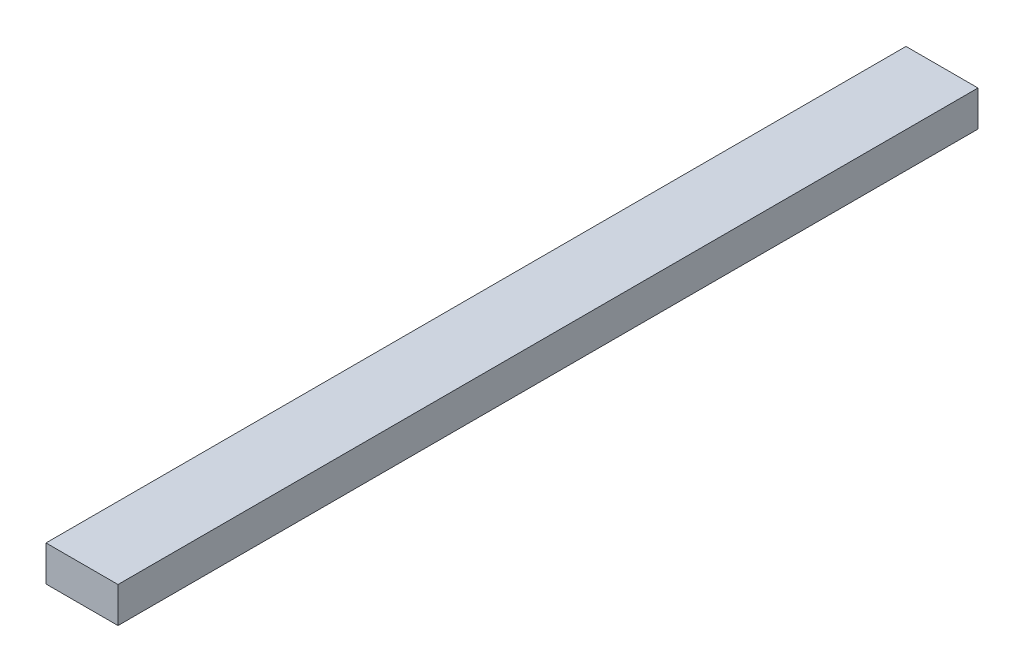
ISO-10303-21;
HEADER;
FILE_DESCRIPTION(('STEP AP214'),'2;1');
FILE_NAME('part.step','',(''),(''),'','','');
FILE_SCHEMA(('AUTOMOTIVE_DESIGN { 1 0 10303 214 1 1 1 1 }'));
ENDSEC;
DATA;
#1=APPLICATION_CONTEXT('core data for automotive mechanical design processes');
#2=APPLICATION_PROTOCOL_DEFINITION('international standard','automotive_design',2000,#1);
#3=PRODUCT_CONTEXT('',#1,'mechanical');
#4=PRODUCT('Part','Part','',(#3));
#5=PRODUCT_RELATED_PRODUCT_CATEGORY('part','',(#4));
#6=PRODUCT_DEFINITION_FORMATION('','',#4);
#7=PRODUCT_DEFINITION_CONTEXT('part definition',#1,'design');
#8=PRODUCT_DEFINITION('design','',#6,#7);
#9=PRODUCT_DEFINITION_SHAPE('','',#8);
#10=(LENGTH_UNIT() NAMED_UNIT(*) SI_UNIT(.MILLI.,.METRE.));
#11=(NAMED_UNIT(*) PLANE_ANGLE_UNIT() SI_UNIT($,.RADIAN.));
#12=(NAMED_UNIT(*) SI_UNIT($,.STERADIAN.) SOLID_ANGLE_UNIT());
#13=UNCERTAINTY_MEASURE_WITH_UNIT(LENGTH_MEASURE(1.E-05),#10,'distance_accuracy_value','');
#14=(GEOMETRIC_REPRESENTATION_CONTEXT(3) GLOBAL_UNCERTAINTY_ASSIGNED_CONTEXT((#13)) GLOBAL_UNIT_ASSIGNED_CONTEXT((#10,
#11,#12)) REPRESENTATION_CONTEXT('',''));
#15=CARTESIAN_POINT('',(0.,0.,0.));
#16=DIRECTION('',(0.,0.,1.));
#17=DIRECTION('',(1.,0.,0.));
#18=AXIS2_PLACEMENT_3D('',#15,#16,#17);
#19=CARTESIAN_POINT('',(6.07,-3.,145.));
#20=DIRECTION('',(-1.,0.,0.));
#21=DIRECTION('',(0.,0.,1.));
#22=AXIS2_PLACEMENT_3D('',#19,#20,#21);
#23=PLANE('',#22);
#24=DIRECTION('',(0.,1.,0.));
#25=VECTOR('',#24,1.);
#26=CARTESIAN_POINT('',(6.07,-3.,0.));
#27=LINE('',#26,#25);
#28=CARTESIAN_POINT('',(6.07,-3.,0.));
#29=VERTEX_POINT('',#28);
#30=CARTESIAN_POINT('',(6.07,3.,0.));
#31=VERTEX_POINT('',#30);
#32=EDGE_CURVE('E95',#29,#31,#27,.T.);
#33=ORIENTED_EDGE('',*,*,#32,.T.);
#34=DIRECTION('',(0.,0.,-1.));
#35=VECTOR('',#34,1.);
#36=CARTESIAN_POINT('',(6.07,3.,145.));
#37=LINE('',#36,#35);
#38=CARTESIAN_POINT('',(6.07,3.,145.));
#39=VERTEX_POINT('',#38);
#40=EDGE_CURVE('E11',#39,#31,#37,.T.);
#41=ORIENTED_EDGE('',*,*,#40,.F.);
#42=DIRECTION('',(0.,1.,0.));
#43=VECTOR('',#42,1.);
#44=CARTESIAN_POINT('',(6.07,-3.,145.));
#45=LINE('',#44,#43);
#46=CARTESIAN_POINT('',(6.07,-3.,145.));
#47=VERTEX_POINT('',#46);
#48=EDGE_CURVE('E83',#47,#39,#45,.T.);
#49=ORIENTED_EDGE('',*,*,#48,.F.);
#50=DIRECTION('',(0.,0.,-1.));
#51=VECTOR('',#50,1.);
#52=CARTESIAN_POINT('',(6.07,-3.,145.));
#53=LINE('',#52,#51);
#54=EDGE_CURVE('E91',#47,#29,#53,.T.);
#55=ORIENTED_EDGE('',*,*,#54,.T.);
#56=EDGE_LOOP('',(#33,#41,#49,#55));
#57=FACE_BOUND('',#56,.T.);
#58=ADVANCED_FACE('F32',(#57),#23,.F.);
#59=CARTESIAN_POINT('',(-6.07,3.,145.));
#60=DIRECTION('',(0.,-1.,0.));
#61=DIRECTION('',(0.,0.,-1.));
#62=AXIS2_PLACEMENT_3D('',#59,#60,#61);
#63=PLANE('',#62);
#64=DIRECTION('',(-1.,0.,0.));
#65=VECTOR('',#64,1.);
#66=CARTESIAN_POINT('',(-6.07,3.,0.));
#67=LINE('',#66,#65);
#68=CARTESIAN_POINT('',(-6.07,3.,0.));
#69=VERTEX_POINT('',#68);
#70=EDGE_CURVE('E87',#31,#69,#67,.T.);
#71=ORIENTED_EDGE('',*,*,#70,.T.);
#72=DIRECTION('',(0.,0.,-1.));
#73=VECTOR('',#72,1.);
#74=CARTESIAN_POINT('',(-6.07,3.,145.));
#75=LINE('',#74,#73);
#76=CARTESIAN_POINT('',(-6.07,3.,145.));
#77=VERTEX_POINT('',#76);
#78=EDGE_CURVE('E40',#77,#69,#75,.T.);
#79=ORIENTED_EDGE('',*,*,#78,.F.);
#80=DIRECTION('',(-1.,0.,0.));
#81=VECTOR('',#80,1.);
#82=CARTESIAN_POINT('',(-6.07,3.,145.));
#83=LINE('',#82,#81);
#84=EDGE_CURVE('E78',#39,#77,#83,.T.);
#85=ORIENTED_EDGE('',*,*,#84,.F.);
#86=ORIENTED_EDGE('',*,*,#40,.T.);
#87=EDGE_LOOP('',(#71,#79,#85,#86));
#88=FACE_BOUND('',#87,.T.);
#89=ADVANCED_FACE('F86',(#88),#63,.F.);
#90=CARTESIAN_POINT('',(-6.07,-3.,145.));
#91=DIRECTION('',(1.,0.,0.));
#92=DIRECTION('',(0.,0.,-1.));
#93=AXIS2_PLACEMENT_3D('',#90,#91,#92);
#94=PLANE('',#93);
#95=DIRECTION('',(0.,-1.,0.));
#96=VECTOR('',#95,1.);
#97=CARTESIAN_POINT('',(-6.07,-3.,0.));
#98=LINE('',#97,#96);
#99=CARTESIAN_POINT('',(-6.07,-3.,0.));
#100=VERTEX_POINT('',#99);
#101=EDGE_CURVE('E65',#69,#100,#98,.T.);
#102=ORIENTED_EDGE('',*,*,#101,.T.);
#103=DIRECTION('',(0.,0.,-1.));
#104=VECTOR('',#103,1.);
#105=CARTESIAN_POINT('',(-6.07,-3.,145.));
#106=LINE('',#105,#104);
#107=CARTESIAN_POINT('',(-6.07,-3.,145.));
#108=VERTEX_POINT('',#107);
#109=EDGE_CURVE('E88',#108,#100,#106,.T.);
#110=ORIENTED_EDGE('',*,*,#109,.F.);
#111=DIRECTION('',(0.,-1.,0.));
#112=VECTOR('',#111,1.);
#113=CARTESIAN_POINT('',(-6.07,-3.,145.));
#114=LINE('',#113,#112);
#115=EDGE_CURVE('E81',#77,#108,#114,.T.);
#116=ORIENTED_EDGE('',*,*,#115,.F.);
#117=ORIENTED_EDGE('',*,*,#78,.T.);
#118=EDGE_LOOP('',(#102,#110,#116,#117));
#119=FACE_BOUND('',#118,.T.);
#120=ADVANCED_FACE('F89',(#119),#94,.F.);
#121=CARTESIAN_POINT('',(-6.07,-3.,145.));
#122=DIRECTION('',(0.,1.,0.));
#123=DIRECTION('',(0.,0.,1.));
#124=AXIS2_PLACEMENT_3D('',#121,#122,#123);
#125=PLANE('',#124);
#126=DIRECTION('',(1.,0.,0.));
#127=VECTOR('',#126,1.);
#128=CARTESIAN_POINT('',(-6.07,-3.,0.));
#129=LINE('',#128,#127);
#130=EDGE_CURVE('E71',#100,#29,#129,.T.);
#131=ORIENTED_EDGE('',*,*,#130,.T.);
#132=ORIENTED_EDGE('',*,*,#54,.F.);
#133=DIRECTION('',(1.,0.,0.));
#134=VECTOR('',#133,1.);
#135=CARTESIAN_POINT('',(-6.07,-3.,145.));
#136=LINE('',#135,#134);
#137=EDGE_CURVE('E48',#108,#47,#136,.T.);
#138=ORIENTED_EDGE('',*,*,#137,.F.);
#139=ORIENTED_EDGE('',*,*,#109,.T.);
#140=EDGE_LOOP('',(#131,#132,#138,#139));
#141=FACE_BOUND('',#140,.T.);
#142=ADVANCED_FACE('F102',(#141),#125,.F.);
#143=CARTESIAN_POINT('',(0.,0.,145.));
#144=DIRECTION('',(0.,0.,-1.));
#145=DIRECTION('',(-1.,0.,0.));
#146=AXIS2_PLACEMENT_3D('',#143,#144,#145);
#147=PLANE('',#146);
#148=ORIENTED_EDGE('',*,*,#48,.T.);
#149=ORIENTED_EDGE('',*,*,#84,.T.);
#150=ORIENTED_EDGE('',*,*,#115,.T.);
#151=ORIENTED_EDGE('',*,*,#137,.T.);
#152=EDGE_LOOP('',(#148,#149,#150,#151));
#153=FACE_BOUND('',#152,.T.);
#154=ADVANCED_FACE('F79',(#153),#147,.F.);
#155=CARTESIAN_POINT('',(0.,0.,0.));
#156=DIRECTION('',(0.,0.,-1.));
#157=DIRECTION('',(-1.,0.,0.));
#158=AXIS2_PLACEMENT_3D('',#155,#156,#157);
#159=PLANE('',#158);
#160=ORIENTED_EDGE('',*,*,#32,.F.);
#161=ORIENTED_EDGE('',*,*,#130,.F.);
#162=ORIENTED_EDGE('',*,*,#101,.F.);
#163=ORIENTED_EDGE('',*,*,#70,.F.);
#164=EDGE_LOOP('',(#160,#161,#162,#163));
#165=FACE_BOUND('',#164,.T.);
#166=ADVANCED_FACE('F105',(#165),#159,.T.);
#167=CLOSED_SHELL('',(#58,#89,#120,#142,#154,#166));
#168=MANIFOLD_SOLID_BREP('B2',#167);
#169=ADVANCED_BREP_SHAPE_REPRESENTATION('',(#18,#168),#14);
#170=SHAPE_DEFINITION_REPRESENTATION(#9,#169);
ENDSEC;
END-ISO-10303-21;
